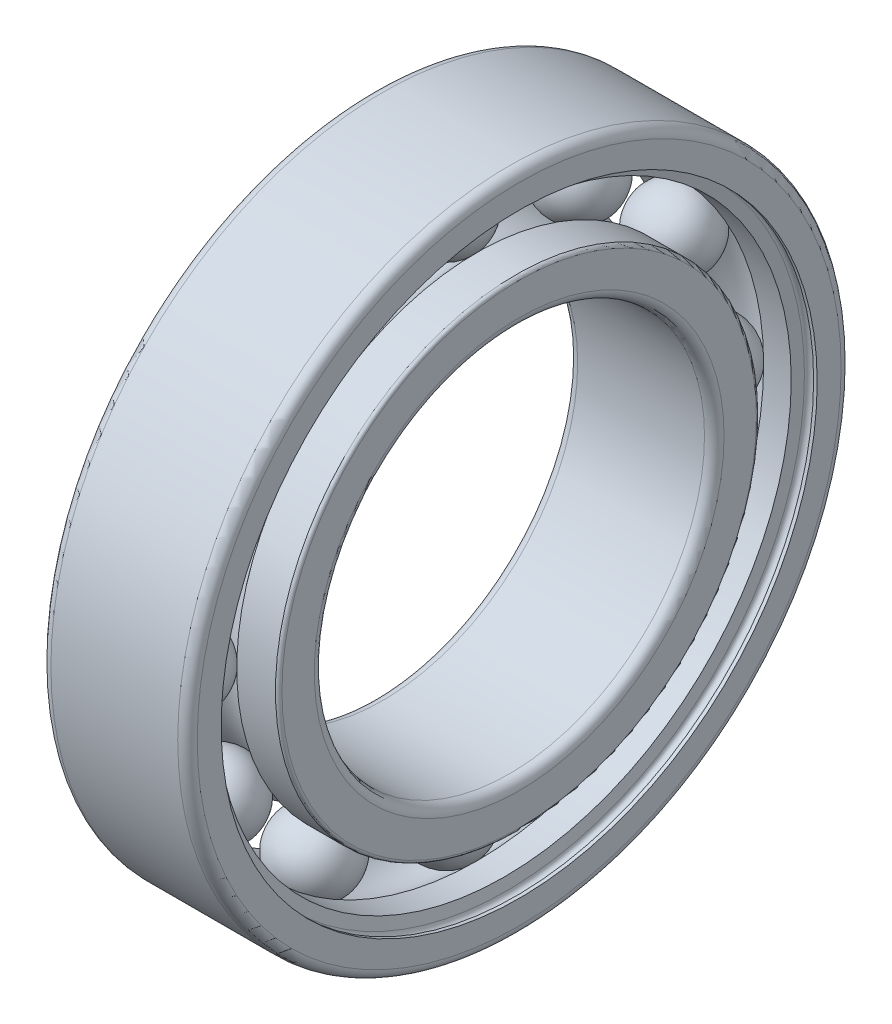
ISO-10303-21;
HEADER;
FILE_DESCRIPTION(('STEP AP214'),'2;1');
FILE_NAME('part.step','',(''),(''),'','','');
FILE_SCHEMA(('AUTOMOTIVE_DESIGN { 1 0 10303 214 1 1 1 1 }'));
ENDSEC;
DATA;
#1=APPLICATION_CONTEXT('core data for automotive mechanical design processes');
#2=APPLICATION_PROTOCOL_DEFINITION('international standard','automotive_design',2000,#1);
#3=PRODUCT_CONTEXT('',#1,'mechanical');
#4=PRODUCT('Part','Part','',(#3));
#5=PRODUCT_RELATED_PRODUCT_CATEGORY('part','',(#4));
#6=PRODUCT_DEFINITION_FORMATION('','',#4);
#7=PRODUCT_DEFINITION_CONTEXT('part definition',#1,'design');
#8=PRODUCT_DEFINITION('design','',#6,#7);
#9=PRODUCT_DEFINITION_SHAPE('','',#8);
#10=(LENGTH_UNIT() NAMED_UNIT(*) SI_UNIT(.MILLI.,.METRE.));
#11=(NAMED_UNIT(*) PLANE_ANGLE_UNIT() SI_UNIT($,.RADIAN.));
#12=(NAMED_UNIT(*) SI_UNIT($,.STERADIAN.) SOLID_ANGLE_UNIT());
#13=UNCERTAINTY_MEASURE_WITH_UNIT(LENGTH_MEASURE(1.E-05),#10,'distance_accuracy_value','');
#14=(GEOMETRIC_REPRESENTATION_CONTEXT(3) GLOBAL_UNCERTAINTY_ASSIGNED_CONTEXT((#13)) GLOBAL_UNIT_ASSIGNED_CONTEXT((#10,
#11,#12)) REPRESENTATION_CONTEXT('',''));
#15=CARTESIAN_POINT('',(0.,0.,0.));
#16=DIRECTION('',(0.,0.,1.));
#17=DIRECTION('',(1.,0.,0.));
#18=AXIS2_PLACEMENT_3D('',#15,#16,#17);
#19=CARTESIAN_POINT('',(0.999999999999221,0.,0.));
#20=DIRECTION('',(1.,0.,0.));
#21=DIRECTION('',(0.,0.,-1.));
#22=AXIS2_PLACEMENT_3D('',#19,#20,#21);
#23=TOROIDAL_SURFACE('',#22,20.9999999999992,0.999999999999221);
#24=CARTESIAN_POINT('',(0.999999999999999,0.,0.));
#25=DIRECTION('',(1.,0.,0.));
#26=DIRECTION('',(0.,0.,-1.));
#27=AXIS2_PLACEMENT_3D('',#24,#25,#26);
#28=CIRCLE('',#27,20.);
#29=CARTESIAN_POINT('',(0.999999999999999,0.,-20.));
#30=VERTEX_POINT('',#29);
#31=EDGE_CURVE('P0_E10',#30,#30,#28,.T.);
#32=ORIENTED_EDGE('',*,*,#31,.T.);
#33=EDGE_LOOP('',(#32));
#34=FACE_BOUND('',#33,.T.);
#35=CARTESIAN_POINT('',(0.,0.,0.));
#36=DIRECTION('',(1.,0.,0.));
#37=DIRECTION('',(0.,0.,-1.));
#38=AXIS2_PLACEMENT_3D('',#35,#36,#37);
#39=CIRCLE('',#38,21.);
#40=CARTESIAN_POINT('',(0.,0.,-21.));
#41=VERTEX_POINT('',#40);
#42=EDGE_CURVE('P0_E48',#41,#41,#39,.T.);
#43=ORIENTED_EDGE('',*,*,#42,.F.);
#44=EDGE_LOOP('',(#43));
#45=FACE_BOUND('',#44,.T.);
#46=ADVANCED_FACE('P0_F14',(#34,#45),#23,.T.);
#47=CARTESIAN_POINT('',(14.,0.,0.));
#48=DIRECTION('',(1.,0.,0.));
#49=DIRECTION('',(0.,0.,-1.));
#50=AXIS2_PLACEMENT_3D('',#47,#48,#49);
#51=CYLINDRICAL_SURFACE('',#50,20.);
#52=CARTESIAN_POINT('',(14.,0.,0.));
#53=DIRECTION('',(1.,0.,0.));
#54=DIRECTION('',(0.,0.,-1.));
#55=AXIS2_PLACEMENT_3D('',#52,#53,#54);
#56=CIRCLE('',#55,20.);
#57=CARTESIAN_POINT('',(14.,0.,-20.));
#58=VERTEX_POINT('',#57);
#59=EDGE_CURVE('P0_E20',#58,#58,#56,.T.);
#60=ORIENTED_EDGE('',*,*,#59,.T.);
#61=EDGE_LOOP('',(#60));
#62=FACE_BOUND('',#61,.T.);
#63=ORIENTED_EDGE('',*,*,#31,.F.);
#64=EDGE_LOOP('',(#63));
#65=FACE_BOUND('',#64,.T.);
#66=ADVANCED_FACE('P0_F56',(#62,#65),#51,.F.);
#67=CARTESIAN_POINT('',(14.0000000000015,0.,0.));
#68=DIRECTION('',(1.,0.,0.));
#69=DIRECTION('',(0.,0.,-1.));
#70=AXIS2_PLACEMENT_3D('',#67,#68,#69);
#71=TOROIDAL_SURFACE('',#70,20.9999999999985,0.99999999999845);
#72=CARTESIAN_POINT('',(15.,0.,0.));
#73=DIRECTION('',(1.,0.,0.));
#74=DIRECTION('',(0.,0.,-1.));
#75=AXIS2_PLACEMENT_3D('',#72,#73,#74);
#76=CIRCLE('',#75,21.);
#77=CARTESIAN_POINT('',(15.,0.,-21.));
#78=VERTEX_POINT('',#77);
#79=EDGE_CURVE('P0_E24',#78,#78,#76,.T.);
#80=ORIENTED_EDGE('',*,*,#79,.T.);
#81=EDGE_LOOP('',(#80));
#82=FACE_BOUND('',#81,.T.);
#83=ORIENTED_EDGE('',*,*,#59,.F.);
#84=EDGE_LOOP('',(#83));
#85=FACE_BOUND('',#84,.T.);
#86=ADVANCED_FACE('P0_F61',(#82,#85),#71,.T.);
#87=CARTESIAN_POINT('',(15.,21.,0.));
#88=DIRECTION('',(1.,0.,0.));
#89=DIRECTION('',(0.,0.,-1.));
#90=AXIS2_PLACEMENT_3D('',#87,#88,#89);
#91=PLANE('',#90);
#92=CARTESIAN_POINT('',(15.,0.,0.));
#93=DIRECTION('',(1.,0.,0.));
#94=DIRECTION('',(0.,0.,-1.));
#95=AXIS2_PLACEMENT_3D('',#92,#93,#94);
#96=CIRCLE('',#95,24.317);
#97=CARTESIAN_POINT('',(15.,0.,-24.317));
#98=VERTEX_POINT('',#97);
#99=EDGE_CURVE('P0_E28',#98,#98,#96,.T.);
#100=ORIENTED_EDGE('',*,*,#99,.T.);
#101=EDGE_LOOP('',(#100));
#102=FACE_BOUND('',#101,.T.);
#103=ORIENTED_EDGE('',*,*,#79,.F.);
#104=EDGE_LOOP('',(#103));
#105=FACE_BOUND('',#104,.T.);
#106=ADVANCED_FACE('P0_F65',(#102,#105),#91,.T.);
#107=CARTESIAN_POINT('',(14.6669999999996,0.,0.));
#108=DIRECTION('',(1.,0.,0.));
#109=DIRECTION('',(0.,0.,-1.));
#110=AXIS2_PLACEMENT_3D('',#107,#108,#109);
#111=TOROIDAL_SURFACE('',#110,24.3169999999996,0.33300000000041);
#112=CARTESIAN_POINT('',(14.667,0.,0.));
#113=DIRECTION('',(1.,0.,0.));
#114=DIRECTION('',(0.,0.,-1.));
#115=AXIS2_PLACEMENT_3D('',#112,#113,#114);
#116=CIRCLE('',#115,24.65);
#117=CARTESIAN_POINT('',(14.667,0.,-24.65));
#118=VERTEX_POINT('',#117);
#119=EDGE_CURVE('P0_E33',#118,#118,#116,.T.);
#120=ORIENTED_EDGE('',*,*,#119,.T.);
#121=EDGE_LOOP('',(#120));
#122=FACE_BOUND('',#121,.T.);
#123=ORIENTED_EDGE('',*,*,#99,.F.);
#124=EDGE_LOOP('',(#123));
#125=FACE_BOUND('',#124,.T.);
#126=ADVANCED_FACE('P0_F72',(#122,#125),#111,.T.);
#127=CARTESIAN_POINT('',(14.,0.,0.));
#128=DIRECTION('',(1.,0.,0.));
#129=DIRECTION('',(0.,0.,-1.));
#130=AXIS2_PLACEMENT_3D('',#127,#128,#129);
#131=CYLINDRICAL_SURFACE('',#130,24.65);
#132=CARTESIAN_POINT('',(10.698509183979,0.,0.));
#133=DIRECTION('',(1.,0.,0.));
#134=DIRECTION('',(0.,0.,-1.));
#135=AXIS2_PLACEMENT_3D('',#132,#133,#134);
#136=CIRCLE('',#135,24.65);
#137=CARTESIAN_POINT('',(10.698509183979,0.,-24.65));
#138=VERTEX_POINT('',#137);
#139=EDGE_CURVE('P0_E36',#138,#138,#136,.T.);
#140=ORIENTED_EDGE('',*,*,#139,.T.);
#141=EDGE_LOOP('',(#140));
#142=FACE_BOUND('',#141,.T.);
#143=ORIENTED_EDGE('',*,*,#119,.F.);
#144=EDGE_LOOP('',(#143));
#145=FACE_BOUND('',#144,.T.);
#146=ADVANCED_FACE('P0_F76',(#142,#145),#131,.T.);
#147=CARTESIAN_POINT('',(7.49999999999985,0.,0.));
#148=DIRECTION('',(1.,0.,0.));
#149=DIRECTION('',(0.,0.,-1.));
#150=AXIS2_PLACEMENT_3D('',#147,#148,#149);
#151=TOROIDAL_SURFACE('',#150,26.9999999999997,3.96899999999968);
#152=CARTESIAN_POINT('',(4.3014908160207,0.,0.));
#153=DIRECTION('',(1.,0.,0.));
#154=DIRECTION('',(0.,0.,-1.));
#155=AXIS2_PLACEMENT_3D('',#152,#153,#154);
#156=CIRCLE('',#155,24.65);
#157=CARTESIAN_POINT('',(4.3014908160207,0.,-24.65));
#158=VERTEX_POINT('',#157);
#159=EDGE_CURVE('P0_E39',#158,#158,#156,.T.);
#160=ORIENTED_EDGE('',*,*,#159,.T.);
#161=EDGE_LOOP('',(#160));
#162=FACE_BOUND('',#161,.T.);
#163=ORIENTED_EDGE('',*,*,#139,.F.);
#164=EDGE_LOOP('',(#163));
#165=FACE_BOUND('',#164,.T.);
#166=ADVANCED_FACE('P0_F80',(#162,#165),#151,.F.);
#167=CARTESIAN_POINT('',(14.,0.,0.));
#168=DIRECTION('',(1.,0.,0.));
#169=DIRECTION('',(0.,0.,-1.));
#170=AXIS2_PLACEMENT_3D('',#167,#168,#169);
#171=CYLINDRICAL_SURFACE('',#170,24.65);
#172=CARTESIAN_POINT('',(0.333,0.,0.));
#173=DIRECTION('',(1.,0.,0.));
#174=DIRECTION('',(0.,0.,-1.));
#175=AXIS2_PLACEMENT_3D('',#172,#173,#174);
#176=CIRCLE('',#175,24.65);
#177=CARTESIAN_POINT('',(0.333,0.,-24.65));
#178=VERTEX_POINT('',#177);
#179=EDGE_CURVE('P0_E42',#178,#178,#176,.T.);
#180=ORIENTED_EDGE('',*,*,#179,.T.);
#181=EDGE_LOOP('',(#180));
#182=FACE_BOUND('',#181,.T.);
#183=ORIENTED_EDGE('',*,*,#159,.F.);
#184=EDGE_LOOP('',(#183));
#185=FACE_BOUND('',#184,.T.);
#186=ADVANCED_FACE('P0_F84',(#182,#185),#171,.T.);
#187=CARTESIAN_POINT('',(0.333000000000206,0.,0.));
#188=DIRECTION('',(1.,0.,0.));
#189=DIRECTION('',(0.,0.,-1.));
#190=AXIS2_PLACEMENT_3D('',#187,#188,#189);
#191=TOROIDAL_SURFACE('',#190,24.3169999999998,0.333000000000205);
#192=CARTESIAN_POINT('',(0.,0.,0.));
#193=DIRECTION('',(1.,0.,0.));
#194=DIRECTION('',(0.,0.,-1.));
#195=AXIS2_PLACEMENT_3D('',#192,#193,#194);
#196=CIRCLE('',#195,24.317);
#197=CARTESIAN_POINT('',(0.,0.,-24.317));
#198=VERTEX_POINT('',#197);
#199=EDGE_CURVE('P0_E45',#198,#198,#196,.T.);
#200=ORIENTED_EDGE('',*,*,#199,.T.);
#201=EDGE_LOOP('',(#200));
#202=FACE_BOUND('',#201,.T.);
#203=ORIENTED_EDGE('',*,*,#179,.F.);
#204=EDGE_LOOP('',(#203));
#205=FACE_BOUND('',#204,.T.);
#206=ADVANCED_FACE('P0_F88',(#202,#205),#191,.T.);
#207=CARTESIAN_POINT('',(0.,24.317,0.));
#208=DIRECTION('',(-1.,0.,0.));
#209=DIRECTION('',(0.,0.,1.));
#210=AXIS2_PLACEMENT_3D('',#207,#208,#209);
#211=PLANE('',#210);
#212=ORIENTED_EDGE('',*,*,#42,.T.);
#213=EDGE_LOOP('',(#212));
#214=FACE_BOUND('',#213,.T.);
#215=ORIENTED_EDGE('',*,*,#199,.F.);
#216=EDGE_LOOP('',(#215));
#217=FACE_BOUND('',#216,.T.);
#218=ADVANCED_FACE('P0_F52',(#214,#217),#211,.T.);
#219=CLOSED_SHELL('',(#46,#66,#86,#106,#126,#146,#166,#186,#206,#218));
#220=MANIFOLD_SOLID_BREP('P0_B1',#219);
#221=CARTESIAN_POINT('',(0.999999999999229,0.,0.));
#222=DIRECTION('',(1.,0.,0.));
#223=DIRECTION('',(0.,0.,-1.));
#224=AXIS2_PLACEMENT_3D('',#221,#222,#223);
#225=TOROIDAL_SURFACE('',#224,33.0000000000008,0.99999999999923);
#226=CARTESIAN_POINT('',(0.,0.,0.));
#227=DIRECTION('',(1.,0.,0.));
#228=DIRECTION('',(0.,0.,-1.));
#229=AXIS2_PLACEMENT_3D('',#226,#227,#228);
#230=CIRCLE('',#229,33.);
#231=CARTESIAN_POINT('',(0.,0.,-33.));
#232=VERTEX_POINT('',#231);
#233=EDGE_CURVE('P1_E10',#232,#232,#230,.T.);
#234=ORIENTED_EDGE('',*,*,#233,.T.);
#235=EDGE_LOOP('',(#234));
#236=FACE_BOUND('',#235,.T.);
#237=CARTESIAN_POINT('',(0.999999999999999,0.,0.));
#238=DIRECTION('',(1.,0.,0.));
#239=DIRECTION('',(0.,0.,-1.));
#240=AXIS2_PLACEMENT_3D('',#237,#238,#239);
#241=CIRCLE('',#240,34.);
#242=CARTESIAN_POINT('',(0.999999999999999,0.,-34.));
#243=VERTEX_POINT('',#242);
#244=EDGE_CURVE('P1_E60',#243,#243,#241,.T.);
#245=ORIENTED_EDGE('',*,*,#244,.F.);
#246=EDGE_LOOP('',(#245));
#247=FACE_BOUND('',#246,.T.);
#248=ADVANCED_FACE('P1_F14',(#236,#247),#225,.T.);
#249=CARTESIAN_POINT('',(0.,33.,0.));
#250=DIRECTION('',(-1.,0.,0.));
#251=DIRECTION('',(0.,0.,1.));
#252=AXIS2_PLACEMENT_3D('',#249,#250,#251);
#253=PLANE('',#252);
#254=CARTESIAN_POINT('',(0.,0.,0.));
#255=DIRECTION('',(1.,0.,0.));
#256=DIRECTION('',(0.,0.,-1.));
#257=AXIS2_PLACEMENT_3D('',#254,#255,#256);
#258=CIRCLE('',#257,30.55);
#259=CARTESIAN_POINT('',(0.,0.,-30.55));
#260=VERTEX_POINT('',#259);
#261=EDGE_CURVE('P1_E20',#260,#260,#258,.T.);
#262=ORIENTED_EDGE('',*,*,#261,.T.);
#263=EDGE_LOOP('',(#262));
#264=FACE_BOUND('',#263,.T.);
#265=ORIENTED_EDGE('',*,*,#233,.F.);
#266=EDGE_LOOP('',(#265));
#267=FACE_BOUND('',#266,.T.);
#268=ADVANCED_FACE('P1_F68',(#264,#267),#253,.T.);
#269=CARTESIAN_POINT('',(14.,0.,0.));
#270=DIRECTION('',(1.,0.,0.));
#271=DIRECTION('',(0.,0.,-1.));
#272=AXIS2_PLACEMENT_3D('',#269,#270,#271);
#273=CYLINDRICAL_SURFACE('',#272,30.55);
#274=CARTESIAN_POINT('',(0.36633333333333,0.,0.));
#275=DIRECTION('',(1.,0.,0.));
#276=DIRECTION('',(0.,0.,-1.));
#277=AXIS2_PLACEMENT_3D('',#274,#275,#276);
#278=CIRCLE('',#277,30.55);
#279=CARTESIAN_POINT('',(0.36633333333333,0.,-30.55));
#280=VERTEX_POINT('',#279);
#281=EDGE_CURVE('P1_E24',#280,#280,#278,.T.);
#282=ORIENTED_EDGE('',*,*,#281,.T.);
#283=EDGE_LOOP('',(#282));
#284=FACE_BOUND('',#283,.T.);
#285=ORIENTED_EDGE('',*,*,#261,.F.);
#286=EDGE_LOOP('',(#285));
#287=FACE_BOUND('',#286,.T.);
#288=ADVANCED_FACE('P1_F73',(#284,#287),#273,.F.);
#289=CARTESIAN_POINT('',(0.837333333333315,0.,0.));
#290=DIRECTION('',(1.,0.,0.));
#291=DIRECTION('',(0.,0.,-1.));
#292=AXIS2_PLACEMENT_3D('',#289,#290,#291);
#293=TOROIDAL_SURFACE('',#292,30.55,0.470999999999985);
#294=CARTESIAN_POINT('',(1.3083333333333,0.,0.));
#295=DIRECTION('',(1.,0.,0.));
#296=DIRECTION('',(0.,0.,-1.));
#297=AXIS2_PLACEMENT_3D('',#294,#295,#296);
#298=CIRCLE('',#297,30.55);
#299=CARTESIAN_POINT('',(1.3083333333333,0.,-30.55));
#300=VERTEX_POINT('',#299);
#301=EDGE_CURVE('P1_E28',#300,#300,#298,.T.);
#302=ORIENTED_EDGE('',*,*,#301,.T.);
#303=EDGE_LOOP('',(#302));
#304=FACE_BOUND('',#303,.T.);
#305=ORIENTED_EDGE('',*,*,#281,.F.);
#306=EDGE_LOOP('',(#305));
#307=FACE_BOUND('',#306,.T.);
#308=ADVANCED_FACE('P1_F77',(#304,#307),#293,.F.);
#309=CARTESIAN_POINT('',(1.3083333333333,0.,0.));
#310=DIRECTION('',(-1.,0.,0.));
#311=DIRECTION('',(0.,0.,1.));
#312=AXIS2_PLACEMENT_3D('',#309,#310,#311);
#313=CONICAL_SURFACE('',#312,30.55,1.39626340159541);
#314=CARTESIAN_POINT('',(1.5111093611481,0.,0.));
#315=DIRECTION('',(1.,0.,0.));
#316=DIRECTION('',(0.,0.,-1.));
#317=AXIS2_PLACEMENT_3D('',#314,#315,#316);
#318=CIRCLE('',#317,29.4);
#319=CARTESIAN_POINT('',(1.5111093611481,0.,-29.4));
#320=VERTEX_POINT('',#319);
#321=EDGE_CURVE('P1_E33',#320,#320,#318,.T.);
#322=ORIENTED_EDGE('',*,*,#321,.T.);
#323=EDGE_LOOP('',(#322));
#324=FACE_BOUND('',#323,.T.);
#325=ORIENTED_EDGE('',*,*,#301,.F.);
#326=EDGE_LOOP('',(#325));
#327=FACE_BOUND('',#326,.T.);
#328=ADVANCED_FACE('P1_F84',(#324,#327),#313,.F.);
#329=CARTESIAN_POINT('',(14.,0.,0.));
#330=DIRECTION('',(1.,0.,0.));
#331=DIRECTION('',(0.,0.,-1.));
#332=AXIS2_PLACEMENT_3D('',#329,#330,#331);
#333=CYLINDRICAL_SURFACE('',#332,29.4);
#334=CARTESIAN_POINT('',(4.3388354993769,0.,0.));
#335=DIRECTION('',(1.,0.,0.));
#336=DIRECTION('',(0.,0.,-1.));
#337=AXIS2_PLACEMENT_3D('',#334,#335,#336);
#338=CIRCLE('',#337,29.4);
#339=CARTESIAN_POINT('',(4.3388354993769,0.,-29.4));
#340=VERTEX_POINT('',#339);
#341=EDGE_CURVE('P1_E36',#340,#340,#338,.T.);
#342=ORIENTED_EDGE('',*,*,#341,.T.);
#343=EDGE_LOOP('',(#342));
#344=FACE_BOUND('',#343,.T.);
#345=ORIENTED_EDGE('',*,*,#321,.F.);
#346=EDGE_LOOP('',(#345));
#347=FACE_BOUND('',#346,.T.);
#348=ADVANCED_FACE('P1_F88',(#344,#347),#333,.F.);
#349=CARTESIAN_POINT('',(7.49999999999995,0.,0.));
#350=DIRECTION('',(1.,0.,0.));
#351=DIRECTION('',(0.,0.,-1.));
#352=AXIS2_PLACEMENT_3D('',#349,#350,#351);
#353=TOROIDAL_SURFACE('',#352,27.0000000000002,3.9689999999998);
#354=CARTESIAN_POINT('',(10.661164500623,0.,0.));
#355=DIRECTION('',(1.,0.,0.));
#356=DIRECTION('',(0.,0.,-1.));
#357=AXIS2_PLACEMENT_3D('',#354,#355,#356);
#358=CIRCLE('',#357,29.4);
#359=CARTESIAN_POINT('',(10.661164500623,0.,-29.4));
#360=VERTEX_POINT('',#359);
#361=EDGE_CURVE('P1_E39',#360,#360,#358,.T.);
#362=ORIENTED_EDGE('',*,*,#361,.T.);
#363=EDGE_LOOP('',(#362));
#364=FACE_BOUND('',#363,.T.);
#365=ORIENTED_EDGE('',*,*,#341,.F.);
#366=EDGE_LOOP('',(#365));
#367=FACE_BOUND('',#366,.T.);
#368=ADVANCED_FACE('P1_F92',(#364,#367),#353,.F.);
#369=CARTESIAN_POINT('',(14.,0.,0.));
#370=DIRECTION('',(1.,0.,0.));
#371=DIRECTION('',(0.,0.,-1.));
#372=AXIS2_PLACEMENT_3D('',#369,#370,#371);
#373=CYLINDRICAL_SURFACE('',#372,29.4);
#374=CARTESIAN_POINT('',(13.488890638852,0.,0.));
#375=DIRECTION('',(1.,0.,0.));
#376=DIRECTION('',(0.,0.,-1.));
#377=AXIS2_PLACEMENT_3D('',#374,#375,#376);
#378=CIRCLE('',#377,29.4);
#379=CARTESIAN_POINT('',(13.488890638852,0.,-29.4));
#380=VERTEX_POINT('',#379);
#381=EDGE_CURVE('P1_E42',#380,#380,#378,.T.);
#382=ORIENTED_EDGE('',*,*,#381,.T.);
#383=EDGE_LOOP('',(#382));
#384=FACE_BOUND('',#383,.T.);
#385=ORIENTED_EDGE('',*,*,#361,.F.);
#386=EDGE_LOOP('',(#385));
#387=FACE_BOUND('',#386,.T.);
#388=ADVANCED_FACE('P1_F96',(#384,#387),#373,.F.);
#389=CARTESIAN_POINT('',(13.488890638852,0.,0.));
#390=DIRECTION('',(1.,0.,0.));
#391=DIRECTION('',(0.,0.,-1.));
#392=AXIS2_PLACEMENT_3D('',#389,#390,#391);
#393=CONICAL_SURFACE('',#392,29.4,1.39626340159524);
#394=CARTESIAN_POINT('',(13.691666666667,0.,0.));
#395=DIRECTION('',(1.,0.,0.));
#396=DIRECTION('',(0.,0.,-1.));
#397=AXIS2_PLACEMENT_3D('',#394,#395,#396);
#398=CIRCLE('',#397,30.55);
#399=CARTESIAN_POINT('',(13.691666666667,0.,-30.55));
#400=VERTEX_POINT('',#399);
#401=EDGE_CURVE('P1_E45',#400,#400,#398,.T.);
#402=ORIENTED_EDGE('',*,*,#401,.T.);
#403=EDGE_LOOP('',(#402));
#404=FACE_BOUND('',#403,.T.);
#405=ORIENTED_EDGE('',*,*,#381,.F.);
#406=EDGE_LOOP('',(#405));
#407=FACE_BOUND('',#406,.T.);
#408=ADVANCED_FACE('P1_F100',(#404,#407),#393,.F.);
#409=CARTESIAN_POINT('',(14.162666666667,0.,0.));
#410=DIRECTION('',(1.,0.,0.));
#411=DIRECTION('',(0.,0.,-1.));
#412=AXIS2_PLACEMENT_3D('',#409,#410,#411);
#413=TOROIDAL_SURFACE('',#412,30.55,0.471);
#414=CARTESIAN_POINT('',(14.633666666667,0.,0.));
#415=DIRECTION('',(1.,0.,0.));
#416=DIRECTION('',(0.,0.,-1.));
#417=AXIS2_PLACEMENT_3D('',#414,#415,#416);
#418=CIRCLE('',#417,30.55);
#419=CARTESIAN_POINT('',(14.633666666667,0.,-30.55));
#420=VERTEX_POINT('',#419);
#421=EDGE_CURVE('P1_E48',#420,#420,#418,.T.);
#422=ORIENTED_EDGE('',*,*,#421,.T.);
#423=EDGE_LOOP('',(#422));
#424=FACE_BOUND('',#423,.T.);
#425=ORIENTED_EDGE('',*,*,#401,.F.);
#426=EDGE_LOOP('',(#425));
#427=FACE_BOUND('',#426,.T.);
#428=ADVANCED_FACE('P1_F104',(#424,#427),#413,.F.);
#429=CARTESIAN_POINT('',(14.,0.,0.));
#430=DIRECTION('',(1.,0.,0.));
#431=DIRECTION('',(0.,0.,-1.));
#432=AXIS2_PLACEMENT_3D('',#429,#430,#431);
#433=CYLINDRICAL_SURFACE('',#432,30.55);
#434=CARTESIAN_POINT('',(15.,0.,0.));
#435=DIRECTION('',(1.,0.,0.));
#436=DIRECTION('',(0.,0.,-1.));
#437=AXIS2_PLACEMENT_3D('',#434,#435,#436);
#438=CIRCLE('',#437,30.55);
#439=CARTESIAN_POINT('',(15.,0.,-30.55));
#440=VERTEX_POINT('',#439);
#441=EDGE_CURVE('P1_E51',#440,#440,#438,.T.);
#442=ORIENTED_EDGE('',*,*,#441,.T.);
#443=EDGE_LOOP('',(#442));
#444=FACE_BOUND('',#443,.T.);
#445=ORIENTED_EDGE('',*,*,#421,.F.);
#446=EDGE_LOOP('',(#445));
#447=FACE_BOUND('',#446,.T.);
#448=ADVANCED_FACE('P1_F108',(#444,#447),#433,.F.);
#449=CARTESIAN_POINT('',(15.,30.55,0.));
#450=DIRECTION('',(1.,0.,0.));
#451=DIRECTION('',(0.,0.,-1.));
#452=AXIS2_PLACEMENT_3D('',#449,#450,#451);
#453=PLANE('',#452);
#454=CARTESIAN_POINT('',(15.,0.,0.));
#455=DIRECTION('',(1.,0.,0.));
#456=DIRECTION('',(0.,0.,-1.));
#457=AXIS2_PLACEMENT_3D('',#454,#455,#456);
#458=CIRCLE('',#457,33.);
#459=CARTESIAN_POINT('',(15.,0.,-33.));
#460=VERTEX_POINT('',#459);
#461=EDGE_CURVE('P1_E54',#460,#460,#458,.T.);
#462=ORIENTED_EDGE('',*,*,#461,.T.);
#463=EDGE_LOOP('',(#462));
#464=FACE_BOUND('',#463,.T.);
#465=ORIENTED_EDGE('',*,*,#441,.F.);
#466=EDGE_LOOP('',(#465));
#467=FACE_BOUND('',#466,.T.);
#468=ADVANCED_FACE('P1_F112',(#464,#467),#453,.T.);
#469=CARTESIAN_POINT('',(14.0000000000015,0.,0.));
#470=DIRECTION('',(1.,0.,0.));
#471=DIRECTION('',(0.,0.,-1.));
#472=AXIS2_PLACEMENT_3D('',#469,#470,#471);
#473=TOROIDAL_SURFACE('',#472,33.0000000000015,0.999999999998469);
#474=CARTESIAN_POINT('',(14.,0.,0.));
#475=DIRECTION('',(1.,0.,0.));
#476=DIRECTION('',(0.,0.,-1.));
#477=AXIS2_PLACEMENT_3D('',#474,#475,#476);
#478=CIRCLE('',#477,34.);
#479=CARTESIAN_POINT('',(14.,0.,-34.));
#480=VERTEX_POINT('',#479);
#481=EDGE_CURVE('P1_E57',#480,#480,#478,.T.);
#482=ORIENTED_EDGE('',*,*,#481,.T.);
#483=EDGE_LOOP('',(#482));
#484=FACE_BOUND('',#483,.T.);
#485=ORIENTED_EDGE('',*,*,#461,.F.);
#486=EDGE_LOOP('',(#485));
#487=FACE_BOUND('',#486,.T.);
#488=ADVANCED_FACE('P1_F116',(#484,#487),#473,.T.);
#489=CARTESIAN_POINT('',(14.,0.,0.));
#490=DIRECTION('',(1.,0.,0.));
#491=DIRECTION('',(0.,0.,-1.));
#492=AXIS2_PLACEMENT_3D('',#489,#490,#491);
#493=CYLINDRICAL_SURFACE('',#492,34.);
#494=ORIENTED_EDGE('',*,*,#244,.T.);
#495=EDGE_LOOP('',(#494));
#496=FACE_BOUND('',#495,.T.);
#497=ORIENTED_EDGE('',*,*,#481,.F.);
#498=EDGE_LOOP('',(#497));
#499=FACE_BOUND('',#498,.T.);
#500=ADVANCED_FACE('P1_F64',(#496,#499),#493,.T.);
#501=CLOSED_SHELL('',(#248,#268,#288,#308,#328,#348,#368,#388,#408,#428,#448,#468,#488,#500));
#502=MANIFOLD_SOLID_BREP('P1_B1',#501);
#503=CARTESIAN_POINT('',(7.5,27.,0.));
#504=DIRECTION('',(1.,0.,0.));
#505=DIRECTION('',(0.,-1.,0.));
#506=AXIS2_PLACEMENT_3D('',#503,#504,#505);
#507=SPHERICAL_SURFACE('',#506,3.969);
#508=CARTESIAN_POINT('',(11.469,27.,0.));
#509=VERTEX_POINT('',#508);
#510=VERTEX_LOOP('',#509);
#511=FACE_BOUND('',#510,.T.);
#512=ADVANCED_FACE('P2_F12',(#511),#507,.T.);
#513=CLOSED_SHELL('',(#512));
#514=MANIFOLD_SOLID_BREP('P2_B1',#513);
#515=CARTESIAN_POINT('',(7.5,0.,27.));
#516=DIRECTION('',(1.,0.,0.));
#517=DIRECTION('',(0.,0.,-1.));
#518=AXIS2_PLACEMENT_3D('',#515,#516,#517);
#519=SPHERICAL_SURFACE('',#518,3.969);
#520=CARTESIAN_POINT('',(11.469,0.,27.));
#521=VERTEX_POINT('',#520);
#522=VERTEX_LOOP('',#521);
#523=FACE_BOUND('',#522,.T.);
#524=ADVANCED_FACE('P3_F12',(#523),#519,.T.);
#525=CLOSED_SHELL('',(#524));
#526=MANIFOLD_SOLID_BREP('P3_B1',#525);
#527=CARTESIAN_POINT('',(7.5,13.5,23.3826859021799));
#528=DIRECTION('',(1.,0.,0.));
#529=DIRECTION('',(0.,-0.499999999999999,-0.866025403784439));
#530=AXIS2_PLACEMENT_3D('',#527,#528,#529);
#531=SPHERICAL_SURFACE('',#530,3.969);
#532=CARTESIAN_POINT('',(11.469,13.5,23.3826859021799));
#533=VERTEX_POINT('',#532);
#534=VERTEX_LOOP('',#533);
#535=FACE_BOUND('',#534,.T.);
#536=ADVANCED_FACE('P4_F12',(#535),#531,.T.);
#537=CLOSED_SHELL('',(#536));
#538=MANIFOLD_SOLID_BREP('P4_B1',#537);
#539=CARTESIAN_POINT('',(7.5,23.3826859021799,13.5));
#540=DIRECTION('',(1.,0.,0.));
#541=DIRECTION('',(0.,-0.866025403784439,-0.499999999999999));
#542=AXIS2_PLACEMENT_3D('',#539,#540,#541);
#543=SPHERICAL_SURFACE('',#542,3.969);
#544=CARTESIAN_POINT('',(11.469,23.3826859021799,13.5));
#545=VERTEX_POINT('',#544);
#546=VERTEX_LOOP('',#545);
#547=FACE_BOUND('',#546,.T.);
#548=ADVANCED_FACE('P5_F12',(#547),#543,.T.);
#549=CLOSED_SHELL('',(#548));
#550=MANIFOLD_SOLID_BREP('P5_B1',#549);
#551=CARTESIAN_POINT('',(7.5,23.3826859021799,-13.5));
#552=DIRECTION('',(1.,0.,0.));
#553=DIRECTION('',(0.,-0.866025403784439,0.499999999999999));
#554=AXIS2_PLACEMENT_3D('',#551,#552,#553);
#555=SPHERICAL_SURFACE('',#554,3.969);
#556=CARTESIAN_POINT('',(11.469,23.3826859021799,-13.5));
#557=VERTEX_POINT('',#556);
#558=VERTEX_LOOP('',#557);
#559=FACE_BOUND('',#558,.T.);
#560=ADVANCED_FACE('P6_F12',(#559),#555,.T.);
#561=CLOSED_SHELL('',(#560));
#562=MANIFOLD_SOLID_BREP('P6_B1',#561);
#563=CARTESIAN_POINT('',(7.5,13.5,-23.3826859021799));
#564=DIRECTION('',(1.,0.,0.));
#565=DIRECTION('',(0.,-0.499999999999999,0.866025403784439));
#566=AXIS2_PLACEMENT_3D('',#563,#564,#565);
#567=SPHERICAL_SURFACE('',#566,3.969);
#568=CARTESIAN_POINT('',(11.469,13.5,-23.3826859021799));
#569=VERTEX_POINT('',#568);
#570=VERTEX_LOOP('',#569);
#571=FACE_BOUND('',#570,.T.);
#572=ADVANCED_FACE('P7_F12',(#571),#567,.T.);
#573=CLOSED_SHELL('',(#572));
#574=MANIFOLD_SOLID_BREP('P7_B1',#573);
#575=CARTESIAN_POINT('',(7.5,0.,-27.));
#576=DIRECTION('',(1.,0.,0.));
#577=DIRECTION('',(0.,0.,1.));
#578=AXIS2_PLACEMENT_3D('',#575,#576,#577);
#579=SPHERICAL_SURFACE('',#578,3.969);
#580=CARTESIAN_POINT('',(11.469,0.,-27.));
#581=VERTEX_POINT('',#580);
#582=VERTEX_LOOP('',#581);
#583=FACE_BOUND('',#582,.T.);
#584=ADVANCED_FACE('P8_F12',(#583),#579,.T.);
#585=CLOSED_SHELL('',(#584));
#586=MANIFOLD_SOLID_BREP('P8_B1',#585);
#587=CARTESIAN_POINT('',(7.5,-13.5,-23.3826859021799));
#588=DIRECTION('',(1.,0.,0.));
#589=DIRECTION('',(0.,0.499999999999999,0.866025403784439));
#590=AXIS2_PLACEMENT_3D('',#587,#588,#589);
#591=SPHERICAL_SURFACE('',#590,3.969);
#592=CARTESIAN_POINT('',(11.469,-13.5,-23.3826859021799));
#593=VERTEX_POINT('',#592);
#594=VERTEX_LOOP('',#593);
#595=FACE_BOUND('',#594,.T.);
#596=ADVANCED_FACE('P9_F12',(#595),#591,.T.);
#597=CLOSED_SHELL('',(#596));
#598=MANIFOLD_SOLID_BREP('P9_B1',#597);
#599=CARTESIAN_POINT('',(7.5,-23.3826859021799,-13.5));
#600=DIRECTION('',(1.,0.,0.));
#601=DIRECTION('',(0.,0.866025403784439,0.499999999999999));
#602=AXIS2_PLACEMENT_3D('',#599,#600,#601);
#603=SPHERICAL_SURFACE('',#602,3.969);
#604=CARTESIAN_POINT('',(11.469,-23.3826859021799,-13.5));
#605=VERTEX_POINT('',#604);
#606=VERTEX_LOOP('',#605);
#607=FACE_BOUND('',#606,.T.);
#608=ADVANCED_FACE('P10_F12',(#607),#603,.T.);
#609=CLOSED_SHELL('',(#608));
#610=MANIFOLD_SOLID_BREP('P10_B1',#609);
#611=CARTESIAN_POINT('',(7.5,-27.,0.));
#612=DIRECTION('',(1.,0.,0.));
#613=DIRECTION('',(0.,1.,0.));
#614=AXIS2_PLACEMENT_3D('',#611,#612,#613);
#615=SPHERICAL_SURFACE('',#614,3.969);
#616=CARTESIAN_POINT('',(11.469,-27.,0.));
#617=VERTEX_POINT('',#616);
#618=VERTEX_LOOP('',#617);
#619=FACE_BOUND('',#618,.T.);
#620=ADVANCED_FACE('P11_F12',(#619),#615,.T.);
#621=CLOSED_SHELL('',(#620));
#622=MANIFOLD_SOLID_BREP('P11_B1',#621);
#623=CARTESIAN_POINT('',(7.5,-23.3826859021799,13.5));
#624=DIRECTION('',(1.,0.,0.));
#625=DIRECTION('',(0.,0.866025403784439,-0.499999999999999));
#626=AXIS2_PLACEMENT_3D('',#623,#624,#625);
#627=SPHERICAL_SURFACE('',#626,3.969);
#628=CARTESIAN_POINT('',(11.469,-23.3826859021799,13.5));
#629=VERTEX_POINT('',#628);
#630=VERTEX_LOOP('',#629);
#631=FACE_BOUND('',#630,.T.);
#632=ADVANCED_FACE('P12_F12',(#631),#627,.T.);
#633=CLOSED_SHELL('',(#632));
#634=MANIFOLD_SOLID_BREP('P12_B1',#633);
#635=CARTESIAN_POINT('',(7.5,-13.5,23.3826859021799));
#636=DIRECTION('',(1.,0.,0.));
#637=DIRECTION('',(0.,0.499999999999999,-0.866025403784439));
#638=AXIS2_PLACEMENT_3D('',#635,#636,#637);
#639=SPHERICAL_SURFACE('',#638,3.969);
#640=CARTESIAN_POINT('',(11.469,-13.5,23.3826859021799));
#641=VERTEX_POINT('',#640);
#642=VERTEX_LOOP('',#641);
#643=FACE_BOUND('',#642,.T.);
#644=ADVANCED_FACE('P13_F12',(#643),#639,.T.);
#645=CLOSED_SHELL('',(#644));
#646=MANIFOLD_SOLID_BREP('P13_B1',#645);
#647=ADVANCED_BREP_SHAPE_REPRESENTATION('',(#18,#220,#502,#514,#526,#538,#550,#562,#574,#586,
#598,#610,#622,#634,#646),#14);
#648=SHAPE_DEFINITION_REPRESENTATION(#9,#647);
ENDSEC;
END-ISO-10303-21;
